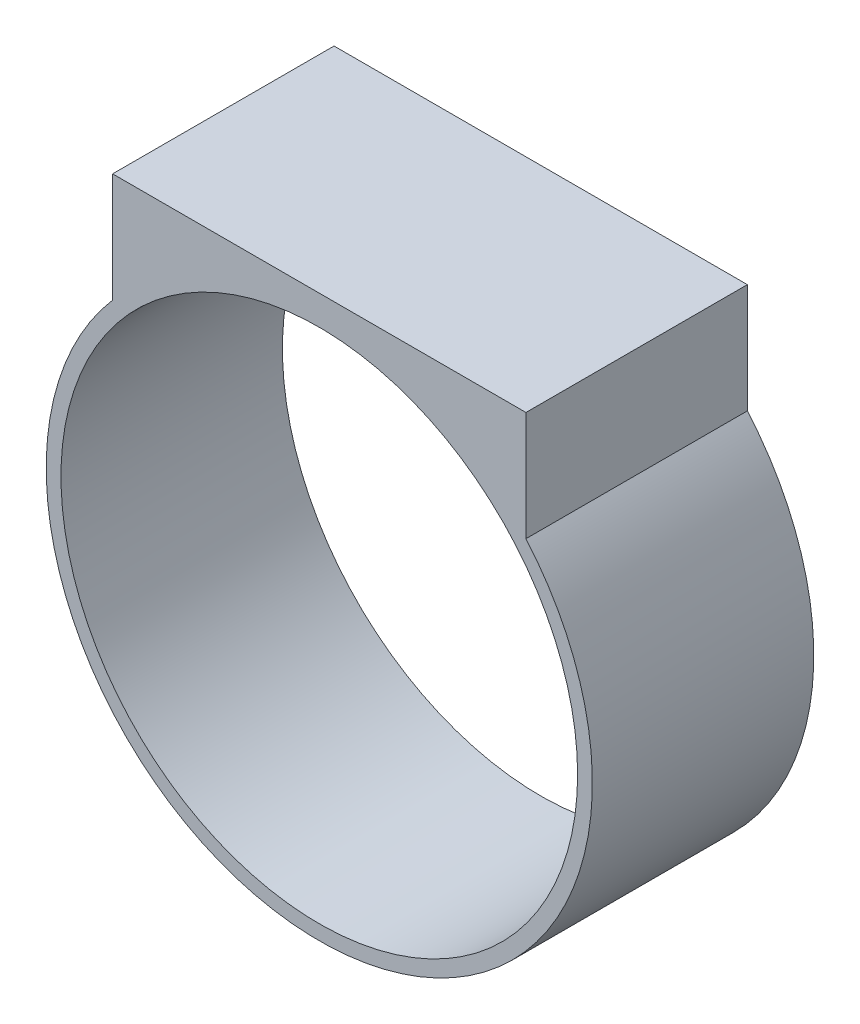
ISO-10303-21;
HEADER;
FILE_DESCRIPTION(('STEP AP214'),'2;1');
FILE_NAME('part.step','',(''),(''),'','','');
FILE_SCHEMA(('AUTOMOTIVE_DESIGN { 1 0 10303 214 1 1 1 1 }'));
ENDSEC;
DATA;
#1=APPLICATION_CONTEXT('core data for automotive mechanical design processes');
#2=APPLICATION_PROTOCOL_DEFINITION('international standard','automotive_design',2000,#1);
#3=PRODUCT_CONTEXT('',#1,'mechanical');
#4=PRODUCT('Part','Part','',(#3));
#5=PRODUCT_RELATED_PRODUCT_CATEGORY('part','',(#4));
#6=PRODUCT_DEFINITION_FORMATION('','',#4);
#7=PRODUCT_DEFINITION_CONTEXT('part definition',#1,'design');
#8=PRODUCT_DEFINITION('design','',#6,#7);
#9=PRODUCT_DEFINITION_SHAPE('','',#8);
#10=(LENGTH_UNIT() NAMED_UNIT(*) SI_UNIT(.MILLI.,.METRE.));
#11=(NAMED_UNIT(*) PLANE_ANGLE_UNIT() SI_UNIT($,.RADIAN.));
#12=(NAMED_UNIT(*) SI_UNIT($,.STERADIAN.) SOLID_ANGLE_UNIT());
#13=UNCERTAINTY_MEASURE_WITH_UNIT(LENGTH_MEASURE(1.E-05),#10,'distance_accuracy_value','');
#14=(GEOMETRIC_REPRESENTATION_CONTEXT(3) GLOBAL_UNCERTAINTY_ASSIGNED_CONTEXT((#13)) GLOBAL_UNIT_ASSIGNED_CONTEXT((#10,
#11,#12)) REPRESENTATION_CONTEXT('',''));
#15=CARTESIAN_POINT('',(0.,0.,0.));
#16=DIRECTION('',(0.,0.,1.));
#17=DIRECTION('',(1.,0.,0.));
#18=AXIS2_PLACEMENT_3D('',#15,#16,#17);
#19=CARTESIAN_POINT('',(0.,0.,75.));
#20=DIRECTION('',(0.,0.,-1.));
#21=DIRECTION('',(-1.,0.,0.));
#22=AXIS2_PLACEMENT_3D('',#19,#20,#21);
#23=CYLINDRICAL_SURFACE('',#22,92.5);
#24=DIRECTION('',(0.,0.,-1.));
#25=VECTOR('',#24,1.);
#26=CARTESIAN_POINT('',(-70.,60.4669331122391,75.));
#27=LINE('',#26,#25);
#28=CARTESIAN_POINT('',(-70.,60.4669331122391,0.));
#29=VERTEX_POINT('',#28);
#30=CARTESIAN_POINT('',(-70.,60.4669331122391,75.));
#31=VERTEX_POINT('',#30);
#32=EDGE_CURVE('E87',#29,#31,#27,.F.);
#33=ORIENTED_EDGE('',*,*,#32,.F.);
#34=CARTESIAN_POINT('',(0.,0.,0.));
#35=DIRECTION('',(0.,0.,1.));
#36=DIRECTION('',(1.,0.,0.));
#37=AXIS2_PLACEMENT_3D('',#34,#35,#36);
#38=CIRCLE('',#37,92.5);
#39=CARTESIAN_POINT('',(70.,60.4669331122391,0.));
#40=VERTEX_POINT('',#39);
#41=EDGE_CURVE('E42',#29,#40,#38,.T.);
#42=ORIENTED_EDGE('',*,*,#41,.T.);
#43=DIRECTION('',(0.,0.,-1.));
#44=VECTOR('',#43,1.);
#45=CARTESIAN_POINT('',(70.,60.4669331122391,75.));
#46=LINE('',#45,#44);
#47=CARTESIAN_POINT('',(70.,60.4669331122391,75.));
#48=VERTEX_POINT('',#47);
#49=EDGE_CURVE('E91',#48,#40,#46,.T.);
#50=ORIENTED_EDGE('',*,*,#49,.F.);
#51=CARTESIAN_POINT('',(0.,0.,75.));
#52=DIRECTION('',(0.,0.,1.));
#53=DIRECTION('',(1.,0.,0.));
#54=AXIS2_PLACEMENT_3D('',#51,#52,#53);
#55=CIRCLE('',#54,92.5);
#56=EDGE_CURVE('E11',#31,#48,#55,.T.);
#57=ORIENTED_EDGE('',*,*,#56,.F.);
#58=EDGE_LOOP('',(#33,#42,#50,#57));
#59=FACE_BOUND('',#58,.T.);
#60=ADVANCED_FACE('F39',(#59),#23,.T.);
#61=CARTESIAN_POINT('',(0.,0.,75.));
#62=DIRECTION('',(0.,0.,1.));
#63=DIRECTION('',(1.,0.,0.));
#64=AXIS2_PLACEMENT_3D('',#61,#62,#63);
#65=PLANE('',#64);
#66=ORIENTED_EDGE('',*,*,#56,.T.);
#67=DIRECTION('',(0.,-1.,0.));
#68=VECTOR('',#67,1.);
#69=CARTESIAN_POINT('',(70.,97.5,75.));
#70=LINE('',#69,#68);
#71=CARTESIAN_POINT('',(70.,97.5,75.));
#72=VERTEX_POINT('',#71);
#73=EDGE_CURVE('E101',#72,#48,#70,.T.);
#74=ORIENTED_EDGE('',*,*,#73,.F.);
#75=DIRECTION('',(1.,0.,0.));
#76=VECTOR('',#75,1.);
#77=CARTESIAN_POINT('',(-70.,97.5,75.));
#78=LINE('',#77,#76);
#79=CARTESIAN_POINT('',(-70.,97.5,75.));
#80=VERTEX_POINT('',#79);
#81=EDGE_CURVE('E147',#80,#72,#78,.T.);
#82=ORIENTED_EDGE('',*,*,#81,.F.);
#83=DIRECTION('',(0.,-1.,0.));
#84=VECTOR('',#83,1.);
#85=CARTESIAN_POINT('',(-70.,97.5,75.));
#86=LINE('',#85,#84);
#87=EDGE_CURVE('E110',#80,#31,#86,.T.);
#88=ORIENTED_EDGE('',*,*,#87,.T.);
#89=EDGE_LOOP('',(#66,#74,#82,#88));
#90=FACE_BOUND('',#89,.T.);
#91=CARTESIAN_POINT('',(0.,0.,75.));
#92=DIRECTION('',(0.,0.,1.));
#93=DIRECTION('',(1.,0.,0.));
#94=AXIS2_PLACEMENT_3D('',#91,#92,#93);
#95=CIRCLE('',#94,87.5);
#96=CARTESIAN_POINT('',(87.5,0.,75.));
#97=VERTEX_POINT('',#96);
#98=EDGE_CURVE('E85',#97,#97,#95,.T.);
#99=ORIENTED_EDGE('',*,*,#98,.F.);
#100=EDGE_LOOP('',(#99));
#101=FACE_BOUND('',#100,.T.);
#102=ADVANCED_FACE('F131',(#90,#101),#65,.T.);
#103=CARTESIAN_POINT('',(0.,0.,0.));
#104=DIRECTION('',(0.,0.,1.));
#105=DIRECTION('',(1.,0.,0.));
#106=AXIS2_PLACEMENT_3D('',#103,#104,#105);
#107=PLANE('',#106);
#108=ORIENTED_EDGE('',*,*,#41,.F.);
#109=DIRECTION('',(0.,-1.,0.));
#110=VECTOR('',#109,1.);
#111=CARTESIAN_POINT('',(-70.,97.5,0.));
#112=LINE('',#111,#110);
#113=CARTESIAN_POINT('',(-70.,97.5,0.));
#114=VERTEX_POINT('',#113);
#115=EDGE_CURVE('E79',#114,#29,#112,.T.);
#116=ORIENTED_EDGE('',*,*,#115,.F.);
#117=DIRECTION('',(-1.,0.,0.));
#118=VECTOR('',#117,1.);
#119=CARTESIAN_POINT('',(-70.,97.5,0.));
#120=LINE('',#119,#118);
#121=CARTESIAN_POINT('',(70.,97.5,0.));
#122=VERTEX_POINT('',#121);
#123=EDGE_CURVE('E97',#122,#114,#120,.T.);
#124=ORIENTED_EDGE('',*,*,#123,.F.);
#125=DIRECTION('',(0.,-1.,0.));
#126=VECTOR('',#125,1.);
#127=CARTESIAN_POINT('',(70.,97.5,0.));
#128=LINE('',#127,#126);
#129=EDGE_CURVE('E82',#122,#40,#128,.T.);
#130=ORIENTED_EDGE('',*,*,#129,.T.);
#131=EDGE_LOOP('',(#108,#116,#124,#130));
#132=FACE_BOUND('',#131,.T.);
#133=CARTESIAN_POINT('',(0.,0.,0.));
#134=DIRECTION('',(0.,0.,1.));
#135=DIRECTION('',(1.,0.,0.));
#136=AXIS2_PLACEMENT_3D('',#133,#134,#135);
#137=CIRCLE('',#136,87.5);
#138=CARTESIAN_POINT('',(87.5,0.,0.));
#139=VERTEX_POINT('',#138);
#140=EDGE_CURVE('E113',#139,#139,#137,.T.);
#141=ORIENTED_EDGE('',*,*,#140,.T.);
#142=EDGE_LOOP('',(#141));
#143=FACE_BOUND('',#142,.T.);
#144=ADVANCED_FACE('F75',(#132,#143),#107,.F.);
#145=CARTESIAN_POINT('',(0.,0.,75.));
#146=DIRECTION('',(0.,0.,-1.));
#147=DIRECTION('',(-1.,0.,0.));
#148=AXIS2_PLACEMENT_3D('',#145,#146,#147);
#149=CYLINDRICAL_SURFACE('',#148,87.5);
#150=ORIENTED_EDGE('',*,*,#98,.T.);
#151=EDGE_LOOP('',(#150));
#152=FACE_BOUND('',#151,.T.);
#153=ORIENTED_EDGE('',*,*,#140,.F.);
#154=EDGE_LOOP('',(#153));
#155=FACE_BOUND('',#154,.T.);
#156=ADVANCED_FACE('F121',(#152,#155),#149,.F.);
#157=CARTESIAN_POINT('',(-70.,97.5,0.));
#158=DIRECTION('',(1.,0.,0.));
#159=DIRECTION('',(0.,0.,-1.));
#160=AXIS2_PLACEMENT_3D('',#157,#158,#159);
#161=PLANE('',#160);
#162=ORIENTED_EDGE('',*,*,#115,.T.);
#163=ORIENTED_EDGE('',*,*,#32,.T.);
#164=ORIENTED_EDGE('',*,*,#87,.F.);
#165=DIRECTION('',(0.,0.,1.));
#166=VECTOR('',#165,1.);
#167=CARTESIAN_POINT('',(-70.,97.5,0.));
#168=LINE('',#167,#166);
#169=EDGE_CURVE('E95',#114,#80,#168,.T.);
#170=ORIENTED_EDGE('',*,*,#169,.F.);
#171=EDGE_LOOP('',(#162,#163,#164,#170));
#172=FACE_BOUND('',#171,.T.);
#173=ADVANCED_FACE('F93',(#172),#161,.F.);
#174=CARTESIAN_POINT('',(70.,97.5,0.));
#175=DIRECTION('',(-1.,0.,0.));
#176=DIRECTION('',(0.,0.,1.));
#177=AXIS2_PLACEMENT_3D('',#174,#175,#176);
#178=PLANE('',#177);
#179=ORIENTED_EDGE('',*,*,#73,.T.);
#180=ORIENTED_EDGE('',*,*,#49,.T.);
#181=ORIENTED_EDGE('',*,*,#129,.F.);
#182=DIRECTION('',(0.,0.,-1.));
#183=VECTOR('',#182,1.);
#184=CARTESIAN_POINT('',(70.,97.5,0.));
#185=LINE('',#184,#183);
#186=EDGE_CURVE('E103',#72,#122,#185,.T.);
#187=ORIENTED_EDGE('',*,*,#186,.F.);
#188=EDGE_LOOP('',(#179,#180,#181,#187));
#189=FACE_BOUND('',#188,.T.);
#190=ADVANCED_FACE('F129',(#189),#178,.F.);
#191=CARTESIAN_POINT('',(0.,97.5,0.));
#192=DIRECTION('',(0.,1.,0.));
#193=DIRECTION('',(0.,0.,1.));
#194=AXIS2_PLACEMENT_3D('',#191,#192,#193);
#195=PLANE('',#194);
#196=ORIENTED_EDGE('',*,*,#169,.T.);
#197=ORIENTED_EDGE('',*,*,#81,.T.);
#198=ORIENTED_EDGE('',*,*,#186,.T.);
#199=ORIENTED_EDGE('',*,*,#123,.T.);
#200=EDGE_LOOP('',(#196,#197,#198,#199));
#201=FACE_BOUND('',#200,.T.);
#202=ADVANCED_FACE('F154',(#201),#195,.T.);
#203=CLOSED_SHELL('',(#60,#102,#144,#156,#173,#190,#202));
#204=MANIFOLD_SOLID_BREP('B2',#203);
#205=ADVANCED_BREP_SHAPE_REPRESENTATION('',(#18,#204),#14);
#206=SHAPE_DEFINITION_REPRESENTATION(#9,#205);
ENDSEC;
END-ISO-10303-21;
